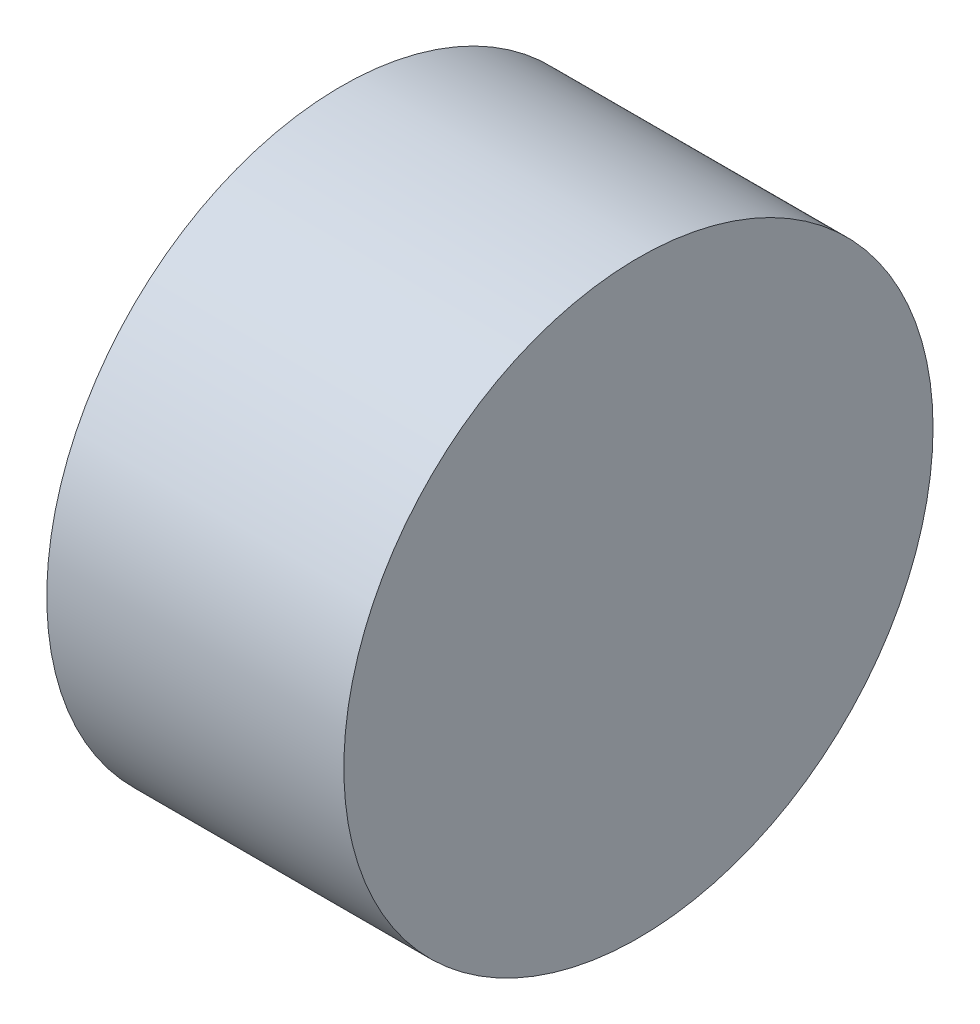
ISO-10303-21;
HEADER;
FILE_DESCRIPTION(('STEP AP214'),'2;1');
FILE_NAME('part.step','',(''),(''),'','','');
FILE_SCHEMA(('AUTOMOTIVE_DESIGN { 1 0 10303 214 1 1 1 1 }'));
ENDSEC;
DATA;
#1=APPLICATION_CONTEXT('core data for automotive mechanical design processes');
#2=APPLICATION_PROTOCOL_DEFINITION('international standard','automotive_design',2000,#1);
#3=PRODUCT_CONTEXT('',#1,'mechanical');
#4=PRODUCT('Part','Part','',(#3));
#5=PRODUCT_RELATED_PRODUCT_CATEGORY('part','',(#4));
#6=PRODUCT_DEFINITION_FORMATION('','',#4);
#7=PRODUCT_DEFINITION_CONTEXT('part definition',#1,'design');
#8=PRODUCT_DEFINITION('design','',#6,#7);
#9=PRODUCT_DEFINITION_SHAPE('','',#8);
#10=(LENGTH_UNIT() NAMED_UNIT(*) SI_UNIT(.MILLI.,.METRE.));
#11=(NAMED_UNIT(*) PLANE_ANGLE_UNIT() SI_UNIT($,.RADIAN.));
#12=(NAMED_UNIT(*) SI_UNIT($,.STERADIAN.) SOLID_ANGLE_UNIT());
#13=UNCERTAINTY_MEASURE_WITH_UNIT(LENGTH_MEASURE(1.E-05),#10,'distance_accuracy_value','');
#14=(GEOMETRIC_REPRESENTATION_CONTEXT(3) GLOBAL_UNCERTAINTY_ASSIGNED_CONTEXT((#13)) GLOBAL_UNIT_ASSIGNED_CONTEXT((#10,
#11,#12)) REPRESENTATION_CONTEXT('',''));
#15=CARTESIAN_POINT('',(0.,0.,0.));
#16=DIRECTION('',(0.,0.,1.));
#17=DIRECTION('',(1.,0.,0.));
#18=AXIS2_PLACEMENT_3D('',#15,#16,#17);
#19=CARTESIAN_POINT('',(150.7,0.,0.));
#20=DIRECTION('',(1.,0.,0.));
#21=DIRECTION('',(0.,0.,-1.));
#22=AXIS2_PLACEMENT_3D('',#19,#20,#21);
#23=PLANE('',#22);
#24=CARTESIAN_POINT('',(150.7,0.,0.));
#25=DIRECTION('',(1.,0.,0.));
#26=DIRECTION('',(0.,0.,-1.));
#27=AXIS2_PLACEMENT_3D('',#24,#25,#26);
#28=CIRCLE('',#27,8.8);
#29=CARTESIAN_POINT('',(150.7,0.,-8.8));
#30=VERTEX_POINT('',#29);
#31=EDGE_CURVE('E10',#30,#30,#28,.T.);
#32=ORIENTED_EDGE('',*,*,#31,.F.);
#33=EDGE_LOOP('',(#32));
#34=FACE_BOUND('',#33,.T.);
#35=ADVANCED_FACE('F34',(#34),#23,.F.);
#36=CARTESIAN_POINT('',(150.7,0.,0.));
#37=DIRECTION('',(-1.,0.,0.));
#38=DIRECTION('',(0.,0.,1.));
#39=AXIS2_PLACEMENT_3D('',#36,#37,#38);
#40=CONICAL_SURFACE('',#39,8.8,0.266252049150925);
#41=CARTESIAN_POINT('',(143.,0.,0.));
#42=DIRECTION('',(1.,0.,0.));
#43=DIRECTION('',(0.,0.,-1.));
#44=AXIS2_PLACEMENT_3D('',#41,#42,#43);
#45=CIRCLE('',#44,10.9);
#46=CARTESIAN_POINT('',(143.,0.,-10.9));
#47=VERTEX_POINT('',#46);
#48=EDGE_CURVE('E40',#47,#47,#45,.T.);
#49=ORIENTED_EDGE('',*,*,#48,.F.);
#50=EDGE_LOOP('',(#49));
#51=FACE_BOUND('',#50,.T.);
#52=ORIENTED_EDGE('',*,*,#31,.T.);
#53=EDGE_LOOP('',(#52));
#54=FACE_BOUND('',#53,.T.);
#55=ADVANCED_FACE('F64',(#51,#54),#40,.F.);
#56=CARTESIAN_POINT('',(143.,0.,10.9));
#57=DIRECTION('',(1.,0.,0.));
#58=DIRECTION('',(0.,0.,-1.));
#59=AXIS2_PLACEMENT_3D('',#56,#57,#58);
#60=PLANE('',#59);
#61=CARTESIAN_POINT('',(143.,0.,0.));
#62=DIRECTION('',(1.,0.,0.));
#63=DIRECTION('',(0.,0.,-1.));
#64=AXIS2_PLACEMENT_3D('',#61,#62,#63);
#65=CIRCLE('',#64,12.);
#66=CARTESIAN_POINT('',(143.,0.,-12.));
#67=VERTEX_POINT('',#66);
#68=EDGE_CURVE('E44',#67,#67,#65,.T.);
#69=ORIENTED_EDGE('',*,*,#68,.F.);
#70=EDGE_LOOP('',(#69));
#71=FACE_BOUND('',#70,.T.);
#72=ORIENTED_EDGE('',*,*,#48,.T.);
#73=EDGE_LOOP('',(#72));
#74=FACE_BOUND('',#73,.T.);
#75=ADVANCED_FACE('F59',(#71,#74),#60,.F.);
#76=CARTESIAN_POINT('',(155.1,0.,0.));
#77=DIRECTION('',(1.,0.,0.));
#78=DIRECTION('',(0.,0.,-1.));
#79=AXIS2_PLACEMENT_3D('',#76,#77,#78);
#80=CYLINDRICAL_SURFACE('',#79,12.);
#81=CARTESIAN_POINT('',(155.1,0.,0.));
#82=DIRECTION('',(1.,0.,0.));
#83=DIRECTION('',(0.,0.,-1.));
#84=AXIS2_PLACEMENT_3D('',#81,#82,#83);
#85=CIRCLE('',#84,12.);
#86=CARTESIAN_POINT('',(155.1,0.,-12.));
#87=VERTEX_POINT('',#86);
#88=EDGE_CURVE('E48',#87,#87,#85,.T.);
#89=ORIENTED_EDGE('',*,*,#88,.F.);
#90=EDGE_LOOP('',(#89));
#91=FACE_BOUND('',#90,.T.);
#92=ORIENTED_EDGE('',*,*,#68,.T.);
#93=EDGE_LOOP('',(#92));
#94=FACE_BOUND('',#93,.T.);
#95=ADVANCED_FACE('F56',(#91,#94),#80,.T.);
#96=CARTESIAN_POINT('',(155.1,0.,12.));
#97=DIRECTION('',(-1.,0.,0.));
#98=DIRECTION('',(0.,0.,1.));
#99=AXIS2_PLACEMENT_3D('',#96,#97,#98);
#100=PLANE('',#99);
#101=ORIENTED_EDGE('',*,*,#88,.T.);
#102=EDGE_LOOP('',(#101));
#103=FACE_BOUND('',#102,.T.);
#104=ADVANCED_FACE('F54',(#103),#100,.F.);
#105=CLOSED_SHELL('',(#35,#55,#75,#95,#104));
#106=MANIFOLD_SOLID_BREP('B2',#105);
#107=ADVANCED_BREP_SHAPE_REPRESENTATION('',(#18,#106),#14);
#108=SHAPE_DEFINITION_REPRESENTATION(#9,#107);
ENDSEC;
END-ISO-10303-21;
